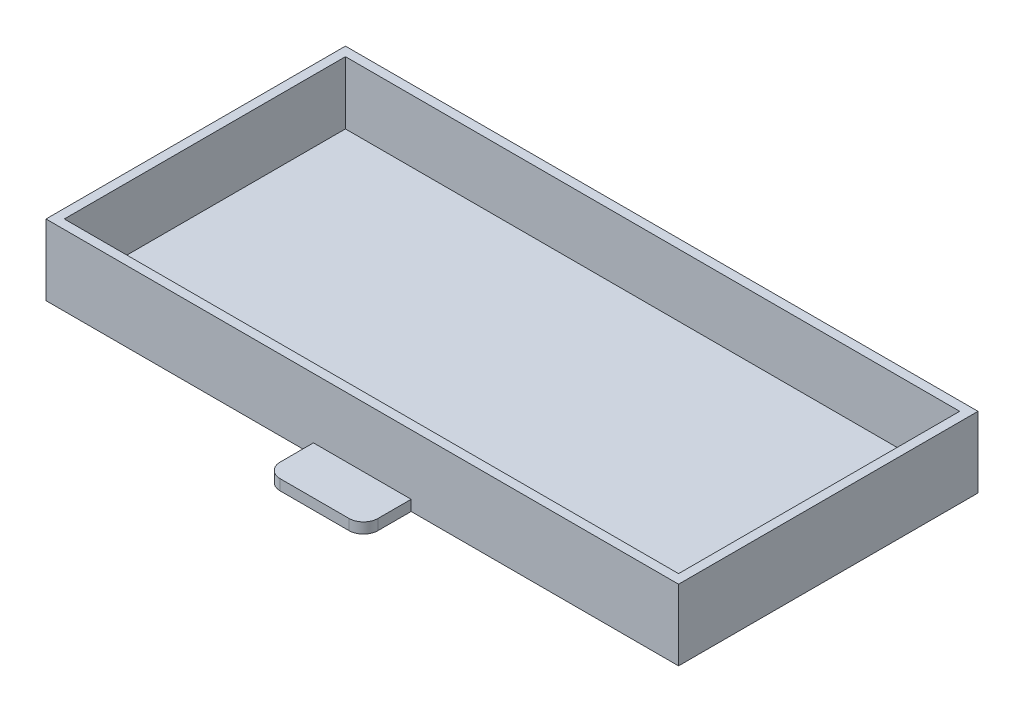
ISO-10303-21;
HEADER;
FILE_DESCRIPTION(('STEP AP214'),'2;1');
FILE_NAME('part.step','',(''),(''),'','','');
FILE_SCHEMA(('AUTOMOTIVE_DESIGN { 1 0 10303 214 1 1 1 1 }'));
ENDSEC;
DATA;
#1=APPLICATION_CONTEXT('core data for automotive mechanical design processes');
#2=APPLICATION_PROTOCOL_DEFINITION('international standard','automotive_design',2000,#1);
#3=PRODUCT_CONTEXT('',#1,'mechanical');
#4=PRODUCT('Part','Part','',(#3));
#5=PRODUCT_RELATED_PRODUCT_CATEGORY('part','',(#4));
#6=PRODUCT_DEFINITION_FORMATION('','',#4);
#7=PRODUCT_DEFINITION_CONTEXT('part definition',#1,'design');
#8=PRODUCT_DEFINITION('design','',#6,#7);
#9=PRODUCT_DEFINITION_SHAPE('','',#8);
#10=(LENGTH_UNIT() NAMED_UNIT(*) SI_UNIT(.MILLI.,.METRE.));
#11=(NAMED_UNIT(*) PLANE_ANGLE_UNIT() SI_UNIT($,.RADIAN.));
#12=(NAMED_UNIT(*) SI_UNIT($,.STERADIAN.) SOLID_ANGLE_UNIT());
#13=UNCERTAINTY_MEASURE_WITH_UNIT(LENGTH_MEASURE(1.E-05),#10,'distance_accuracy_value','');
#14=(GEOMETRIC_REPRESENTATION_CONTEXT(3) GLOBAL_UNCERTAINTY_ASSIGNED_CONTEXT((#13)) GLOBAL_UNIT_ASSIGNED_CONTEXT((#10,
#11,#12)) REPRESENTATION_CONTEXT('',''));
#15=CARTESIAN_POINT('',(0.,0.,0.));
#16=DIRECTION('',(0.,0.,1.));
#17=DIRECTION('',(1.,0.,0.));
#18=AXIS2_PLACEMENT_3D('',#15,#16,#17);
#19=CARTESIAN_POINT('',(-65.7,14.7,31.1));
#20=DIRECTION('',(0.,0.,-1.));
#21=DIRECTION('',(-1.,0.,0.));
#22=AXIS2_PLACEMENT_3D('',#19,#20,#21);
#23=PLANE('',#22);
#24=DIRECTION('',(0.,-1.,0.));
#25=VECTOR('',#24,1.);
#26=CARTESIAN_POINT('',(-10.15,2.2,31.1));
#27=LINE('',#26,#25);
#28=CARTESIAN_POINT('',(-10.15,2.2,31.1));
#29=VERTEX_POINT('',#28);
#30=CARTESIAN_POINT('',(-10.15,0.,31.1));
#31=VERTEX_POINT('',#30);
#32=EDGE_CURVE('E146',#29,#31,#27,.T.);
#33=ORIENTED_EDGE('',*,*,#32,.F.);
#34=DIRECTION('',(1.,0.,0.));
#35=VECTOR('',#34,1.);
#36=CARTESIAN_POINT('',(-10.15,2.2,31.1));
#37=LINE('',#36,#35);
#38=CARTESIAN_POINT('',(10.15,2.2,31.1));
#39=VERTEX_POINT('',#38);
#40=EDGE_CURVE('E150',#29,#39,#37,.T.);
#41=ORIENTED_EDGE('',*,*,#40,.T.);
#42=DIRECTION('',(0.,-1.,0.));
#43=VECTOR('',#42,1.);
#44=CARTESIAN_POINT('',(10.15,2.2,31.1));
#45=LINE('',#44,#43);
#46=CARTESIAN_POINT('',(10.15,0.,31.1));
#47=VERTEX_POINT('',#46);
#48=EDGE_CURVE('E163',#39,#47,#45,.T.);
#49=ORIENTED_EDGE('',*,*,#48,.T.);
#50=DIRECTION('',(1.,0.,0.));
#51=VECTOR('',#50,1.);
#52=CARTESIAN_POINT('',(-65.7,0.,31.1));
#53=LINE('',#52,#51);
#54=CARTESIAN_POINT('',(65.7,0.,31.1));
#55=VERTEX_POINT('',#54);
#56=EDGE_CURVE('E236',#47,#55,#53,.T.);
#57=ORIENTED_EDGE('',*,*,#56,.T.);
#58=DIRECTION('',(0.,-1.,0.));
#59=VECTOR('',#58,1.);
#60=CARTESIAN_POINT('',(65.7,14.7,31.1));
#61=LINE('',#60,#59);
#62=CARTESIAN_POINT('',(65.7,14.7,31.1));
#63=VERTEX_POINT('',#62);
#64=EDGE_CURVE('E251',#63,#55,#61,.T.);
#65=ORIENTED_EDGE('',*,*,#64,.F.);
#66=DIRECTION('',(1.,0.,0.));
#67=VECTOR('',#66,1.);
#68=CARTESIAN_POINT('',(-65.7,14.7,31.1));
#69=LINE('',#68,#67);
#70=CARTESIAN_POINT('',(-65.7,14.7,31.1));
#71=VERTEX_POINT('',#70);
#72=EDGE_CURVE('E222',#71,#63,#69,.T.);
#73=ORIENTED_EDGE('',*,*,#72,.F.);
#74=DIRECTION('',(0.,-1.,0.));
#75=VECTOR('',#74,1.);
#76=CARTESIAN_POINT('',(-65.7,14.7,31.1));
#77=LINE('',#76,#75);
#78=CARTESIAN_POINT('',(-65.7,0.,31.1));
#79=VERTEX_POINT('',#78);
#80=EDGE_CURVE('E255',#71,#79,#77,.T.);
#81=ORIENTED_EDGE('',*,*,#80,.T.);
#82=EDGE_CURVE('E161',#79,#31,#53,.T.);
#83=ORIENTED_EDGE('',*,*,#82,.T.);
#84=EDGE_LOOP('',(#33,#41,#49,#57,#65,#73,#81,#83));
#85=FACE_BOUND('',#84,.T.);
#86=ADVANCED_FACE('F39',(#85),#23,.F.);
#87=CARTESIAN_POINT('',(-65.7,14.7,-31.1));
#88=DIRECTION('',(1.,0.,0.));
#89=DIRECTION('',(0.,0.,-1.));
#90=AXIS2_PLACEMENT_3D('',#87,#88,#89);
#91=PLANE('',#90);
#92=DIRECTION('',(0.,0.,1.));
#93=VECTOR('',#92,1.);
#94=CARTESIAN_POINT('',(-65.7,0.,-31.1));
#95=LINE('',#94,#93);
#96=CARTESIAN_POINT('',(-65.7,0.,-31.1));
#97=VERTEX_POINT('',#96);
#98=EDGE_CURVE('E208',#97,#79,#95,.T.);
#99=ORIENTED_EDGE('',*,*,#98,.T.);
#100=ORIENTED_EDGE('',*,*,#80,.F.);
#101=DIRECTION('',(0.,0.,1.));
#102=VECTOR('',#101,1.);
#103=CARTESIAN_POINT('',(-65.7,14.7,-31.1));
#104=LINE('',#103,#102);
#105=CARTESIAN_POINT('',(-65.7,14.7,-31.1));
#106=VERTEX_POINT('',#105);
#107=EDGE_CURVE('E218',#106,#71,#104,.T.);
#108=ORIENTED_EDGE('',*,*,#107,.F.);
#109=DIRECTION('',(0.,-1.,0.));
#110=VECTOR('',#109,1.);
#111=CARTESIAN_POINT('',(-65.7,14.7,-31.1));
#112=LINE('',#111,#110);
#113=EDGE_CURVE('E232',#106,#97,#112,.T.);
#114=ORIENTED_EDGE('',*,*,#113,.T.);
#115=EDGE_LOOP('',(#99,#100,#108,#114));
#116=FACE_BOUND('',#115,.T.);
#117=ADVANCED_FACE('F315',(#116),#91,.F.);
#118=CARTESIAN_POINT('',(65.7,14.7,-31.1));
#119=DIRECTION('',(-1.,0.,0.));
#120=DIRECTION('',(0.,0.,1.));
#121=AXIS2_PLACEMENT_3D('',#118,#119,#120);
#122=PLANE('',#121);
#123=DIRECTION('',(0.,0.,-1.));
#124=VECTOR('',#123,1.);
#125=CARTESIAN_POINT('',(65.7,0.,-31.1));
#126=LINE('',#125,#124);
#127=CARTESIAN_POINT('',(65.7,0.,-31.1));
#128=VERTEX_POINT('',#127);
#129=EDGE_CURVE('E239',#55,#128,#126,.T.);
#130=ORIENTED_EDGE('',*,*,#129,.T.);
#131=DIRECTION('',(0.,-1.,0.));
#132=VECTOR('',#131,1.);
#133=CARTESIAN_POINT('',(65.7,14.7,-31.1));
#134=LINE('',#133,#132);
#135=CARTESIAN_POINT('',(65.7,14.7,-31.1));
#136=VERTEX_POINT('',#135);
#137=EDGE_CURVE('E247',#136,#128,#134,.T.);
#138=ORIENTED_EDGE('',*,*,#137,.F.);
#139=DIRECTION('',(0.,0.,-1.));
#140=VECTOR('',#139,1.);
#141=CARTESIAN_POINT('',(65.7,14.7,-31.1));
#142=LINE('',#141,#140);
#143=EDGE_CURVE('E226',#63,#136,#142,.T.);
#144=ORIENTED_EDGE('',*,*,#143,.F.);
#145=ORIENTED_EDGE('',*,*,#64,.T.);
#146=EDGE_LOOP('',(#130,#138,#144,#145));
#147=FACE_BOUND('',#146,.T.);
#148=ADVANCED_FACE('F305',(#147),#122,.F.);
#149=CARTESIAN_POINT('',(-65.7,14.7,-31.1));
#150=DIRECTION('',(0.,0.,1.));
#151=DIRECTION('',(1.,0.,0.));
#152=AXIS2_PLACEMENT_3D('',#149,#150,#151);
#153=PLANE('',#152);
#154=DIRECTION('',(-1.,0.,0.));
#155=VECTOR('',#154,1.);
#156=CARTESIAN_POINT('',(-65.7,0.,-31.1));
#157=LINE('',#156,#155);
#158=EDGE_CURVE('E223',#128,#97,#157,.T.);
#159=ORIENTED_EDGE('',*,*,#158,.T.);
#160=ORIENTED_EDGE('',*,*,#113,.F.);
#161=DIRECTION('',(-1.,0.,0.));
#162=VECTOR('',#161,1.);
#163=CARTESIAN_POINT('',(-65.7,14.7,-31.1));
#164=LINE('',#163,#162);
#165=EDGE_CURVE('E229',#136,#106,#164,.T.);
#166=ORIENTED_EDGE('',*,*,#165,.F.);
#167=ORIENTED_EDGE('',*,*,#137,.T.);
#168=EDGE_LOOP('',(#159,#160,#166,#167));
#169=FACE_BOUND('',#168,.T.);
#170=ADVANCED_FACE('F311',(#169),#153,.F.);
#171=CARTESIAN_POINT('',(0.,14.7,0.));
#172=DIRECTION('',(0.,1.,0.));
#173=DIRECTION('',(0.,0.,1.));
#174=AXIS2_PLACEMENT_3D('',#171,#172,#173);
#175=PLANE('',#174);
#176=DIRECTION('',(0.,0.,1.));
#177=VECTOR('',#176,1.);
#178=CARTESIAN_POINT('',(-63.8,14.7,-29.2));
#179=LINE('',#178,#177);
#180=CARTESIAN_POINT('',(-63.8,14.7,-29.2));
#181=VERTEX_POINT('',#180);
#182=CARTESIAN_POINT('',(-63.8,14.7,29.2));
#183=VERTEX_POINT('',#182);
#184=EDGE_CURVE('E168',#181,#183,#179,.T.);
#185=ORIENTED_EDGE('',*,*,#184,.F.);
#186=DIRECTION('',(-1.,0.,0.));
#187=VECTOR('',#186,1.);
#188=CARTESIAN_POINT('',(-63.8,14.7,-29.2));
#189=LINE('',#188,#187);
#190=CARTESIAN_POINT('',(63.8,14.7,-29.2));
#191=VERTEX_POINT('',#190);
#192=EDGE_CURVE('E179',#191,#181,#189,.T.);
#193=ORIENTED_EDGE('',*,*,#192,.F.);
#194=DIRECTION('',(0.,0.,-1.));
#195=VECTOR('',#194,1.);
#196=CARTESIAN_POINT('',(63.8,14.7,-29.2));
#197=LINE('',#196,#195);
#198=CARTESIAN_POINT('',(63.8,14.7,29.2));
#199=VERTEX_POINT('',#198);
#200=EDGE_CURVE('E198',#199,#191,#197,.T.);
#201=ORIENTED_EDGE('',*,*,#200,.F.);
#202=DIRECTION('',(1.,0.,0.));
#203=VECTOR('',#202,1.);
#204=CARTESIAN_POINT('',(-63.8,14.7,29.2));
#205=LINE('',#204,#203);
#206=EDGE_CURVE('E194',#183,#199,#205,.T.);
#207=ORIENTED_EDGE('',*,*,#206,.F.);
#208=EDGE_LOOP('',(#185,#193,#201,#207));
#209=FACE_BOUND('',#208,.T.);
#210=ORIENTED_EDGE('',*,*,#107,.T.);
#211=ORIENTED_EDGE('',*,*,#72,.T.);
#212=ORIENTED_EDGE('',*,*,#143,.T.);
#213=ORIENTED_EDGE('',*,*,#165,.T.);
#214=EDGE_LOOP('',(#210,#211,#212,#213));
#215=FACE_BOUND('',#214,.T.);
#216=ADVANCED_FACE('F318',(#209,#215),#175,.T.);
#217=CARTESIAN_POINT('',(0.,0.,0.));
#218=DIRECTION('',(0.,1.,0.));
#219=DIRECTION('',(0.,0.,1.));
#220=AXIS2_PLACEMENT_3D('',#217,#218,#219);
#221=PLANE('',#220);
#222=DIRECTION('',(-1.,0.,0.));
#223=VECTOR('',#222,1.);
#224=CARTESIAN_POINT('',(-10.15,0.,41.));
#225=LINE('',#224,#223);
#226=CARTESIAN_POINT('',(7.15,0.,41.));
#227=VERTEX_POINT('',#226);
#228=CARTESIAN_POINT('',(-7.15,0.,41.));
#229=VERTEX_POINT('',#228);
#230=EDGE_CURVE('E151',#227,#229,#225,.T.);
#231=ORIENTED_EDGE('',*,*,#230,.T.);
#232=CARTESIAN_POINT('',(-7.15,0.,38.));
#233=DIRECTION('',(0.,1.,0.));
#234=DIRECTION('',(0.,0.,1.));
#235=AXIS2_PLACEMENT_3D('',#232,#233,#234);
#236=CIRCLE('',#235,3.);
#237=CARTESIAN_POINT('',(-10.15,0.,38.));
#238=VERTEX_POINT('',#237);
#239=EDGE_CURVE('E268',#229,#238,#236,.F.);
#240=ORIENTED_EDGE('',*,*,#239,.T.);
#241=DIRECTION('',(0.,0.,-1.));
#242=VECTOR('',#241,1.);
#243=CARTESIAN_POINT('',(-10.15,0.,31.1));
#244=LINE('',#243,#242);
#245=EDGE_CURVE('E285',#238,#31,#244,.T.);
#246=ORIENTED_EDGE('',*,*,#245,.T.);
#247=ORIENTED_EDGE('',*,*,#82,.F.);
#248=ORIENTED_EDGE('',*,*,#98,.F.);
#249=ORIENTED_EDGE('',*,*,#158,.F.);
#250=ORIENTED_EDGE('',*,*,#129,.F.);
#251=ORIENTED_EDGE('',*,*,#56,.F.);
#252=DIRECTION('',(0.,0.,1.));
#253=VECTOR('',#252,1.);
#254=CARTESIAN_POINT('',(10.15,0.,31.1));
#255=LINE('',#254,#253);
#256=CARTESIAN_POINT('',(10.15,0.,38.));
#257=VERTEX_POINT('',#256);
#258=EDGE_CURVE('E287',#47,#257,#255,.T.);
#259=ORIENTED_EDGE('',*,*,#258,.T.);
#260=CARTESIAN_POINT('',(7.15,0.,38.));
#261=DIRECTION('',(0.,1.,0.));
#262=DIRECTION('',(0.,0.,1.));
#263=AXIS2_PLACEMENT_3D('',#260,#261,#262);
#264=CIRCLE('',#263,3.);
#265=EDGE_CURVE('E265',#257,#227,#264,.F.);
#266=ORIENTED_EDGE('',*,*,#265,.T.);
#267=EDGE_LOOP('',(#231,#240,#246,#247,#248,#249,#250,#251,#259,#266));
#268=FACE_BOUND('',#267,.T.);
#269=ADVANCED_FACE('F284',(#268),#221,.F.);
#270=CARTESIAN_POINT('',(-63.8,1.7,-29.2));
#271=DIRECTION('',(-1.,0.,0.));
#272=DIRECTION('',(0.,0.,1.));
#273=AXIS2_PLACEMENT_3D('',#270,#271,#272);
#274=PLANE('',#273);
#275=ORIENTED_EDGE('',*,*,#184,.T.);
#276=DIRECTION('',(0.,1.,0.));
#277=VECTOR('',#276,1.);
#278=CARTESIAN_POINT('',(-63.8,1.7,29.2));
#279=LINE('',#278,#277);
#280=CARTESIAN_POINT('',(-63.8,1.7,29.2));
#281=VERTEX_POINT('',#280);
#282=EDGE_CURVE('E191',#281,#183,#279,.T.);
#283=ORIENTED_EDGE('',*,*,#282,.F.);
#284=DIRECTION('',(0.,0.,1.));
#285=VECTOR('',#284,1.);
#286=CARTESIAN_POINT('',(-63.8,1.7,-29.2));
#287=LINE('',#286,#285);
#288=CARTESIAN_POINT('',(-63.8,1.7,-29.2));
#289=VERTEX_POINT('',#288);
#290=EDGE_CURVE('E174',#289,#281,#287,.T.);
#291=ORIENTED_EDGE('',*,*,#290,.F.);
#292=DIRECTION('',(0.,1.,0.));
#293=VECTOR('',#292,1.);
#294=CARTESIAN_POINT('',(-63.8,1.7,-29.2));
#295=LINE('',#294,#293);
#296=EDGE_CURVE('E205',#289,#181,#295,.T.);
#297=ORIENTED_EDGE('',*,*,#296,.T.);
#298=EDGE_LOOP('',(#275,#283,#291,#297));
#299=FACE_BOUND('',#298,.T.);
#300=ADVANCED_FACE('F326',(#299),#274,.F.);
#301=CARTESIAN_POINT('',(-63.8,1.7,-29.2));
#302=DIRECTION('',(0.,0.,-1.));
#303=DIRECTION('',(-1.,0.,0.));
#304=AXIS2_PLACEMENT_3D('',#301,#302,#303);
#305=PLANE('',#304);
#306=ORIENTED_EDGE('',*,*,#192,.T.);
#307=ORIENTED_EDGE('',*,*,#296,.F.);
#308=DIRECTION('',(-1.,0.,0.));
#309=VECTOR('',#308,1.);
#310=CARTESIAN_POINT('',(-63.8,1.7,-29.2));
#311=LINE('',#310,#309);
#312=CARTESIAN_POINT('',(63.8,1.7,-29.2));
#313=VERTEX_POINT('',#312);
#314=EDGE_CURVE('E187',#313,#289,#311,.T.);
#315=ORIENTED_EDGE('',*,*,#314,.F.);
#316=DIRECTION('',(0.,1.,0.));
#317=VECTOR('',#316,1.);
#318=CARTESIAN_POINT('',(63.8,1.7,-29.2));
#319=LINE('',#318,#317);
#320=EDGE_CURVE('E209',#313,#191,#319,.T.);
#321=ORIENTED_EDGE('',*,*,#320,.T.);
#322=EDGE_LOOP('',(#306,#307,#315,#321));
#323=FACE_BOUND('',#322,.T.);
#324=ADVANCED_FACE('F358',(#323),#305,.F.);
#325=CARTESIAN_POINT('',(63.8,1.7,-29.2));
#326=DIRECTION('',(1.,0.,0.));
#327=DIRECTION('',(0.,0.,-1.));
#328=AXIS2_PLACEMENT_3D('',#325,#326,#327);
#329=PLANE('',#328);
#330=ORIENTED_EDGE('',*,*,#200,.T.);
#331=ORIENTED_EDGE('',*,*,#320,.F.);
#332=DIRECTION('',(0.,0.,-1.));
#333=VECTOR('',#332,1.);
#334=CARTESIAN_POINT('',(63.8,1.7,-29.2));
#335=LINE('',#334,#333);
#336=CARTESIAN_POINT('',(63.8,1.7,29.2));
#337=VERTEX_POINT('',#336);
#338=EDGE_CURVE('E183',#337,#313,#335,.T.);
#339=ORIENTED_EDGE('',*,*,#338,.F.);
#340=DIRECTION('',(0.,1.,0.));
#341=VECTOR('',#340,1.);
#342=CARTESIAN_POINT('',(63.8,1.7,29.2));
#343=LINE('',#342,#341);
#344=EDGE_CURVE('E212',#337,#199,#343,.T.);
#345=ORIENTED_EDGE('',*,*,#344,.T.);
#346=EDGE_LOOP('',(#330,#331,#339,#345));
#347=FACE_BOUND('',#346,.T.);
#348=ADVANCED_FACE('F361',(#347),#329,.F.);
#349=CARTESIAN_POINT('',(-63.8,1.7,29.2));
#350=DIRECTION('',(0.,0.,1.));
#351=DIRECTION('',(1.,0.,0.));
#352=AXIS2_PLACEMENT_3D('',#349,#350,#351);
#353=PLANE('',#352);
#354=ORIENTED_EDGE('',*,*,#206,.T.);
#355=ORIENTED_EDGE('',*,*,#344,.F.);
#356=DIRECTION('',(1.,0.,0.));
#357=VECTOR('',#356,1.);
#358=CARTESIAN_POINT('',(-63.8,1.7,29.2));
#359=LINE('',#358,#357);
#360=EDGE_CURVE('E178',#281,#337,#359,.T.);
#361=ORIENTED_EDGE('',*,*,#360,.F.);
#362=ORIENTED_EDGE('',*,*,#282,.T.);
#363=EDGE_LOOP('',(#354,#355,#361,#362));
#364=FACE_BOUND('',#363,.T.);
#365=ADVANCED_FACE('F356',(#364),#353,.F.);
#366=CARTESIAN_POINT('',(0.,1.7,0.));
#367=DIRECTION('',(0.,1.,0.));
#368=DIRECTION('',(0.,0.,1.));
#369=AXIS2_PLACEMENT_3D('',#366,#367,#368);
#370=PLANE('',#369);
#371=ORIENTED_EDGE('',*,*,#290,.T.);
#372=ORIENTED_EDGE('',*,*,#360,.T.);
#373=ORIENTED_EDGE('',*,*,#338,.T.);
#374=ORIENTED_EDGE('',*,*,#314,.T.);
#375=EDGE_LOOP('',(#371,#372,#373,#374));
#376=FACE_BOUND('',#375,.T.);
#377=ADVANCED_FACE('F353',(#376),#370,.T.);
#378=CARTESIAN_POINT('',(-10.15,2.2,31.1));
#379=DIRECTION('',(-1.,0.,0.));
#380=DIRECTION('',(0.,0.,1.));
#381=AXIS2_PLACEMENT_3D('',#378,#379,#380);
#382=PLANE('',#381);
#383=ORIENTED_EDGE('',*,*,#245,.F.);
#384=DIRECTION('',(0.,-1.,0.));
#385=VECTOR('',#384,1.);
#386=CARTESIAN_POINT('',(-10.15,2.2,38.));
#387=LINE('',#386,#385);
#388=CARTESIAN_POINT('',(-10.15,2.2,38.));
#389=VERTEX_POINT('',#388);
#390=EDGE_CURVE('E63',#238,#389,#387,.F.);
#391=ORIENTED_EDGE('',*,*,#390,.T.);
#392=DIRECTION('',(0.,0.,-1.));
#393=VECTOR('',#392,1.);
#394=CARTESIAN_POINT('',(-10.15,2.2,31.1));
#395=LINE('',#394,#393);
#396=EDGE_CURVE('E142',#389,#29,#395,.T.);
#397=ORIENTED_EDGE('',*,*,#396,.T.);
#398=ORIENTED_EDGE('',*,*,#32,.T.);
#399=EDGE_LOOP('',(#383,#391,#397,#398));
#400=FACE_BOUND('',#399,.T.);
#401=ADVANCED_FACE('F144',(#400),#382,.T.);
#402=CARTESIAN_POINT('',(-10.15,2.2,41.));
#403=DIRECTION('',(0.,0.,1.));
#404=DIRECTION('',(1.,0.,0.));
#405=AXIS2_PLACEMENT_3D('',#402,#403,#404);
#406=PLANE('',#405);
#407=DIRECTION('',(-1.,0.,0.));
#408=VECTOR('',#407,1.);
#409=CARTESIAN_POINT('',(-10.15,2.2,41.));
#410=LINE('',#409,#408);
#411=CARTESIAN_POINT('',(7.15,2.2,41.));
#412=VERTEX_POINT('',#411);
#413=CARTESIAN_POINT('',(-7.15,2.2,41.));
#414=VERTEX_POINT('',#413);
#415=EDGE_CURVE('E164',#412,#414,#410,.T.);
#416=ORIENTED_EDGE('',*,*,#415,.T.);
#417=DIRECTION('',(0.,-1.,0.));
#418=VECTOR('',#417,1.);
#419=CARTESIAN_POINT('',(-7.15,2.2,41.));
#420=LINE('',#419,#418);
#421=EDGE_CURVE('E261',#414,#229,#420,.T.);
#422=ORIENTED_EDGE('',*,*,#421,.T.);
#423=ORIENTED_EDGE('',*,*,#230,.F.);
#424=DIRECTION('',(0.,-1.,0.));
#425=VECTOR('',#424,1.);
#426=CARTESIAN_POINT('',(7.15,2.2,41.));
#427=LINE('',#426,#425);
#428=EDGE_CURVE('E258',#227,#412,#427,.F.);
#429=ORIENTED_EDGE('',*,*,#428,.T.);
#430=EDGE_LOOP('',(#416,#422,#423,#429));
#431=FACE_BOUND('',#430,.T.);
#432=ADVANCED_FACE('F278',(#431),#406,.T.);
#433=CARTESIAN_POINT('',(10.15,2.2,31.1));
#434=DIRECTION('',(1.,0.,0.));
#435=DIRECTION('',(0.,0.,-1.));
#436=AXIS2_PLACEMENT_3D('',#433,#434,#435);
#437=PLANE('',#436);
#438=DIRECTION('',(0.,0.,1.));
#439=VECTOR('',#438,1.);
#440=CARTESIAN_POINT('',(10.15,2.2,31.1));
#441=LINE('',#440,#439);
#442=CARTESIAN_POINT('',(10.15,2.2,38.));
#443=VERTEX_POINT('',#442);
#444=EDGE_CURVE('E155',#39,#443,#441,.T.);
#445=ORIENTED_EDGE('',*,*,#444,.T.);
#446=DIRECTION('',(0.,-1.,0.));
#447=VECTOR('',#446,1.);
#448=CARTESIAN_POINT('',(10.15,2.2,38.));
#449=LINE('',#448,#447);
#450=EDGE_CURVE('E11',#443,#257,#449,.T.);
#451=ORIENTED_EDGE('',*,*,#450,.T.);
#452=ORIENTED_EDGE('',*,*,#258,.F.);
#453=ORIENTED_EDGE('',*,*,#48,.F.);
#454=EDGE_LOOP('',(#445,#451,#452,#453));
#455=FACE_BOUND('',#454,.T.);
#456=ADVANCED_FACE('F297',(#455),#437,.T.);
#457=CARTESIAN_POINT('',(0.,2.2,0.));
#458=DIRECTION('',(0.,1.,0.));
#459=DIRECTION('',(0.,0.,1.));
#460=AXIS2_PLACEMENT_3D('',#457,#458,#459);
#461=PLANE('',#460);
#462=ORIENTED_EDGE('',*,*,#396,.F.);
#463=CARTESIAN_POINT('',(-7.15,2.2,38.));
#464=DIRECTION('',(0.,1.,0.));
#465=DIRECTION('',(0.,0.,1.));
#466=AXIS2_PLACEMENT_3D('',#463,#464,#465);
#467=CIRCLE('',#466,3.);
#468=EDGE_CURVE('E48',#389,#414,#467,.T.);
#469=ORIENTED_EDGE('',*,*,#468,.T.);
#470=ORIENTED_EDGE('',*,*,#415,.F.);
#471=CARTESIAN_POINT('',(7.15,2.2,38.));
#472=DIRECTION('',(0.,1.,0.));
#473=DIRECTION('',(0.,0.,1.));
#474=AXIS2_PLACEMENT_3D('',#471,#472,#473);
#475=CIRCLE('',#474,3.);
#476=EDGE_CURVE('E55',#412,#443,#475,.T.);
#477=ORIENTED_EDGE('',*,*,#476,.T.);
#478=ORIENTED_EDGE('',*,*,#444,.F.);
#479=ORIENTED_EDGE('',*,*,#40,.F.);
#480=EDGE_LOOP('',(#462,#469,#470,#477,#478,#479));
#481=FACE_BOUND('',#480,.T.);
#482=ADVANCED_FACE('F154',(#481),#461,.T.);
#483=CARTESIAN_POINT('',(-7.15,2.2,38.));
#484=DIRECTION('',(0.,-1.,0.));
#485=DIRECTION('',(0.,0.,-1.));
#486=AXIS2_PLACEMENT_3D('',#483,#484,#485);
#487=CYLINDRICAL_SURFACE('',#486,3.);
#488=ORIENTED_EDGE('',*,*,#468,.F.);
#489=ORIENTED_EDGE('',*,*,#390,.F.);
#490=ORIENTED_EDGE('',*,*,#239,.F.);
#491=ORIENTED_EDGE('',*,*,#421,.F.);
#492=EDGE_LOOP('',(#488,#489,#490,#491));
#493=FACE_BOUND('',#492,.T.);
#494=ADVANCED_FACE('F282',(#493),#487,.T.);
#495=CARTESIAN_POINT('',(7.15,2.2,38.));
#496=DIRECTION('',(0.,-1.,0.));
#497=DIRECTION('',(0.,0.,-1.));
#498=AXIS2_PLACEMENT_3D('',#495,#496,#497);
#499=CYLINDRICAL_SURFACE('',#498,3.);
#500=ORIENTED_EDGE('',*,*,#476,.F.);
#501=ORIENTED_EDGE('',*,*,#428,.F.);
#502=ORIENTED_EDGE('',*,*,#265,.F.);
#503=ORIENTED_EDGE('',*,*,#450,.F.);
#504=EDGE_LOOP('',(#500,#501,#502,#503));
#505=FACE_BOUND('',#504,.T.);
#506=ADVANCED_FACE('F41',(#505),#499,.T.);
#507=CLOSED_SHELL('',(#86,#117,#148,#170,#216,#269,#300,#324,#348,#365,#377,#401,#432,#456,#482,
#494,#506));
#508=MANIFOLD_SOLID_BREP('B2',#507);
#509=ADVANCED_BREP_SHAPE_REPRESENTATION('',(#18,#508),#14);
#510=SHAPE_DEFINITION_REPRESENTATION(#9,#509);
ENDSEC;
END-ISO-10303-21;
